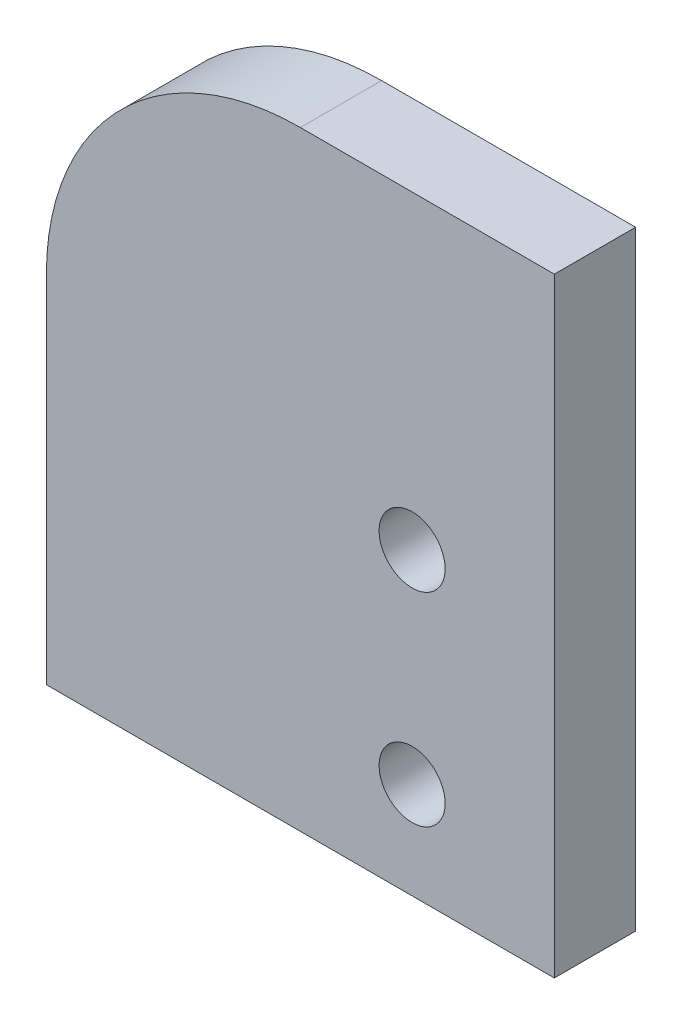
ISO-10303-21;
HEADER;
FILE_DESCRIPTION(('STEP AP214'),'2;1');
FILE_NAME('part.step','',(''),(''),'','','');
FILE_SCHEMA(('AUTOMOTIVE_DESIGN { 1 0 10303 214 1 1 1 1 }'));
ENDSEC;
DATA;
#1=APPLICATION_CONTEXT('core data for automotive mechanical design processes');
#2=APPLICATION_PROTOCOL_DEFINITION('international standard','automotive_design',2000,#1);
#3=PRODUCT_CONTEXT('',#1,'mechanical');
#4=PRODUCT('Part','Part','',(#3));
#5=PRODUCT_RELATED_PRODUCT_CATEGORY('part','',(#4));
#6=PRODUCT_DEFINITION_FORMATION('','',#4);
#7=PRODUCT_DEFINITION_CONTEXT('part definition',#1,'design');
#8=PRODUCT_DEFINITION('design','',#6,#7);
#9=PRODUCT_DEFINITION_SHAPE('','',#8);
#10=(LENGTH_UNIT() NAMED_UNIT(*) SI_UNIT(.MILLI.,.METRE.));
#11=(NAMED_UNIT(*) PLANE_ANGLE_UNIT() SI_UNIT($,.RADIAN.));
#12=(NAMED_UNIT(*) SI_UNIT($,.STERADIAN.) SOLID_ANGLE_UNIT());
#13=UNCERTAINTY_MEASURE_WITH_UNIT(LENGTH_MEASURE(1.E-05),#10,'distance_accuracy_value','');
#14=(GEOMETRIC_REPRESENTATION_CONTEXT(3) GLOBAL_UNCERTAINTY_ASSIGNED_CONTEXT((#13)) GLOBAL_UNIT_ASSIGNED_CONTEXT((#10,
#11,#12)) REPRESENTATION_CONTEXT('',''));
#15=CARTESIAN_POINT('',(0.,0.,0.));
#16=DIRECTION('',(0.,0.,1.));
#17=DIRECTION('',(1.,0.,0.));
#18=AXIS2_PLACEMENT_3D('',#15,#16,#17);
#19=CARTESIAN_POINT('',(0.,20.,4.));
#20=DIRECTION('',(-1.,0.,0.));
#21=DIRECTION('',(0.,0.,1.));
#22=AXIS2_PLACEMENT_3D('',#19,#20,#21);
#23=PLANE('',#22);
#24=DIRECTION('',(0.,1.,0.));
#25=VECTOR('',#24,1.);
#26=CARTESIAN_POINT('',(0.,20.,0.));
#27=LINE('',#26,#25);
#28=CARTESIAN_POINT('',(0.,0.,0.));
#29=VERTEX_POINT('',#28);
#30=CARTESIAN_POINT('',(0.,30.,0.));
#31=VERTEX_POINT('',#30);
#32=EDGE_CURVE('E76',#29,#31,#27,.T.);
#33=ORIENTED_EDGE('',*,*,#32,.T.);
#34=DIRECTION('',(0.,0.,-1.));
#35=VECTOR('',#34,1.);
#36=CARTESIAN_POINT('',(0.,30.,4.));
#37=LINE('',#36,#35);
#38=CARTESIAN_POINT('',(0.,30.,4.));
#39=VERTEX_POINT('',#38);
#40=EDGE_CURVE('E11',#39,#31,#37,.T.);
#41=ORIENTED_EDGE('',*,*,#40,.F.);
#42=DIRECTION('',(0.,1.,0.));
#43=VECTOR('',#42,1.);
#44=CARTESIAN_POINT('',(0.,0.,4.));
#45=LINE('',#44,#43);
#46=CARTESIAN_POINT('',(0.,0.,4.));
#47=VERTEX_POINT('',#46);
#48=EDGE_CURVE('E82',#47,#39,#45,.T.);
#49=ORIENTED_EDGE('',*,*,#48,.F.);
#50=DIRECTION('',(0.,0.,-1.));
#51=VECTOR('',#50,1.);
#52=CARTESIAN_POINT('',(0.,0.,4.));
#53=LINE('',#52,#51);
#54=EDGE_CURVE('E106',#47,#29,#53,.T.);
#55=ORIENTED_EDGE('',*,*,#54,.T.);
#56=EDGE_LOOP('',(#33,#41,#49,#55));
#57=FACE_BOUND('',#56,.T.);
#58=ADVANCED_FACE('F33',(#57),#23,.F.);
#59=CARTESIAN_POINT('',(-12.5,30.,4.));
#60=DIRECTION('',(0.,-1.,0.));
#61=DIRECTION('',(0.,0.,-1.));
#62=AXIS2_PLACEMENT_3D('',#59,#60,#61);
#63=PLANE('',#62);
#64=DIRECTION('',(-1.,0.,0.));
#65=VECTOR('',#64,1.);
#66=CARTESIAN_POINT('',(-12.5,30.,0.));
#67=LINE('',#66,#65);
#68=CARTESIAN_POINT('',(-12.5,30.,0.));
#69=VERTEX_POINT('',#68);
#70=EDGE_CURVE('E111',#31,#69,#67,.T.);
#71=ORIENTED_EDGE('',*,*,#70,.T.);
#72=DIRECTION('',(0.,0.,-1.));
#73=VECTOR('',#72,1.);
#74=CARTESIAN_POINT('',(-12.5,30.,4.));
#75=LINE('',#74,#73);
#76=CARTESIAN_POINT('',(-12.5,30.,4.));
#77=VERTEX_POINT('',#76);
#78=EDGE_CURVE('E41',#77,#69,#75,.T.);
#79=ORIENTED_EDGE('',*,*,#78,.F.);
#80=DIRECTION('',(-1.,0.,0.));
#81=VECTOR('',#80,1.);
#82=CARTESIAN_POINT('',(-12.5,30.,4.));
#83=LINE('',#82,#81);
#84=EDGE_CURVE('E93',#39,#77,#83,.T.);
#85=ORIENTED_EDGE('',*,*,#84,.F.);
#86=ORIENTED_EDGE('',*,*,#40,.T.);
#87=EDGE_LOOP('',(#71,#79,#85,#86));
#88=FACE_BOUND('',#87,.T.);
#89=ADVANCED_FACE('F162',(#88),#63,.F.);
#90=CARTESIAN_POINT('',(-12.5,17.5,4.));
#91=DIRECTION('',(0.,0.,-1.));
#92=DIRECTION('',(-1.,0.,0.));
#93=AXIS2_PLACEMENT_3D('',#90,#91,#92);
#94=CYLINDRICAL_SURFACE('',#93,12.5);
#95=CARTESIAN_POINT('',(-12.5,17.5,0.));
#96=DIRECTION('',(0.,0.,1.));
#97=DIRECTION('',(1.,0.,0.));
#98=AXIS2_PLACEMENT_3D('',#95,#96,#97);
#99=CIRCLE('',#98,12.5);
#100=CARTESIAN_POINT('',(-25.,17.5,0.));
#101=VERTEX_POINT('',#100);
#102=EDGE_CURVE('E101',#69,#101,#99,.T.);
#103=ORIENTED_EDGE('',*,*,#102,.T.);
#104=DIRECTION('',(0.,0.,-1.));
#105=VECTOR('',#104,1.);
#106=CARTESIAN_POINT('',(-25.,17.5,4.));
#107=LINE('',#106,#105);
#108=CARTESIAN_POINT('',(-25.,17.5,4.));
#109=VERTEX_POINT('',#108);
#110=EDGE_CURVE('E98',#109,#101,#107,.T.);
#111=ORIENTED_EDGE('',*,*,#110,.F.);
#112=CARTESIAN_POINT('',(-12.5,17.5,4.));
#113=DIRECTION('',(0.,0.,1.));
#114=DIRECTION('',(1.,0.,0.));
#115=AXIS2_PLACEMENT_3D('',#112,#113,#114);
#116=CIRCLE('',#115,12.5);
#117=EDGE_CURVE('E87',#77,#109,#116,.T.);
#118=ORIENTED_EDGE('',*,*,#117,.F.);
#119=ORIENTED_EDGE('',*,*,#78,.T.);
#120=EDGE_LOOP('',(#103,#111,#118,#119));
#121=FACE_BOUND('',#120,.T.);
#122=ADVANCED_FACE('F99',(#121),#94,.T.);
#123=CARTESIAN_POINT('',(-25.,0.,4.));
#124=DIRECTION('',(1.,0.,0.));
#125=DIRECTION('',(0.,0.,-1.));
#126=AXIS2_PLACEMENT_3D('',#123,#124,#125);
#127=PLANE('',#126);
#128=DIRECTION('',(0.,-1.,0.));
#129=VECTOR('',#128,1.);
#130=CARTESIAN_POINT('',(-25.,0.,0.));
#131=LINE('',#130,#129);
#132=CARTESIAN_POINT('',(-25.,0.,0.));
#133=VERTEX_POINT('',#132);
#134=EDGE_CURVE('E69',#101,#133,#131,.T.);
#135=ORIENTED_EDGE('',*,*,#134,.T.);
#136=DIRECTION('',(0.,0.,-1.));
#137=VECTOR('',#136,1.);
#138=CARTESIAN_POINT('',(-25.,0.,4.));
#139=LINE('',#138,#137);
#140=CARTESIAN_POINT('',(-25.,0.,4.));
#141=VERTEX_POINT('',#140);
#142=EDGE_CURVE('E102',#141,#133,#139,.T.);
#143=ORIENTED_EDGE('',*,*,#142,.F.);
#144=DIRECTION('',(0.,-1.,0.));
#145=VECTOR('',#144,1.);
#146=CARTESIAN_POINT('',(-25.,0.,4.));
#147=LINE('',#146,#145);
#148=EDGE_CURVE('E91',#109,#141,#147,.T.);
#149=ORIENTED_EDGE('',*,*,#148,.F.);
#150=ORIENTED_EDGE('',*,*,#110,.T.);
#151=EDGE_LOOP('',(#135,#143,#149,#150));
#152=FACE_BOUND('',#151,.T.);
#153=ADVANCED_FACE('F104',(#152),#127,.F.);
#154=CARTESIAN_POINT('',(0.,0.,4.));
#155=DIRECTION('',(0.,1.,0.));
#156=DIRECTION('',(-1.,0.,0.));
#157=AXIS2_PLACEMENT_3D('',#154,#155,#156);
#158=PLANE('',#157);
#159=DIRECTION('',(1.,0.,0.));
#160=VECTOR('',#159,1.);
#161=CARTESIAN_POINT('',(0.,0.,0.));
#162=LINE('',#161,#160);
#163=EDGE_CURVE('E116',#133,#29,#162,.T.);
#164=ORIENTED_EDGE('',*,*,#163,.T.);
#165=ORIENTED_EDGE('',*,*,#54,.F.);
#166=DIRECTION('',(1.,0.,0.));
#167=VECTOR('',#166,1.);
#168=CARTESIAN_POINT('',(0.,0.,4.));
#169=LINE('',#168,#167);
#170=EDGE_CURVE('E49',#141,#47,#169,.T.);
#171=ORIENTED_EDGE('',*,*,#170,.F.);
#172=ORIENTED_EDGE('',*,*,#142,.T.);
#173=EDGE_LOOP('',(#164,#165,#171,#172));
#174=FACE_BOUND('',#173,.T.);
#175=ADVANCED_FACE('F123',(#174),#158,.F.);
#176=CARTESIAN_POINT('',(-12.5,17.5,4.));
#177=DIRECTION('',(0.,0.,1.));
#178=DIRECTION('',(1.,0.,0.));
#179=AXIS2_PLACEMENT_3D('',#176,#177,#178);
#180=PLANE('',#179);
#181=CARTESIAN_POINT('',(-7.,4.75,4.));
#182=DIRECTION('',(0.,0.,1.));
#183=DIRECTION('',(1.,0.,0.));
#184=AXIS2_PLACEMENT_3D('',#181,#182,#183);
#185=CIRCLE('',#184,1.625);
#186=CARTESIAN_POINT('',(-5.375,4.75,4.));
#187=VERTEX_POINT('',#186);
#188=EDGE_CURVE('E133',#187,#187,#185,.T.);
#189=ORIENTED_EDGE('',*,*,#188,.F.);
#190=EDGE_LOOP('',(#189));
#191=FACE_BOUND('',#190,.T.);
#192=CARTESIAN_POINT('',(-7.,14.75,4.));
#193=DIRECTION('',(0.,0.,1.));
#194=DIRECTION('',(1.,0.,0.));
#195=AXIS2_PLACEMENT_3D('',#192,#193,#194);
#196=CIRCLE('',#195,1.625);
#197=CARTESIAN_POINT('',(-5.375,14.75,4.));
#198=VERTEX_POINT('',#197);
#199=EDGE_CURVE('E127',#198,#198,#196,.T.);
#200=ORIENTED_EDGE('',*,*,#199,.F.);
#201=EDGE_LOOP('',(#200));
#202=FACE_BOUND('',#201,.T.);
#203=ORIENTED_EDGE('',*,*,#48,.T.);
#204=ORIENTED_EDGE('',*,*,#84,.T.);
#205=ORIENTED_EDGE('',*,*,#117,.T.);
#206=ORIENTED_EDGE('',*,*,#148,.T.);
#207=ORIENTED_EDGE('',*,*,#170,.T.);
#208=EDGE_LOOP('',(#203,#204,#205,#206,#207));
#209=FACE_BOUND('',#208,.T.);
#210=ADVANCED_FACE('F89',(#191,#202,#209),#180,.T.);
#211=CARTESIAN_POINT('',(-12.5,17.5,0.));
#212=DIRECTION('',(0.,0.,1.));
#213=DIRECTION('',(1.,0.,0.));
#214=AXIS2_PLACEMENT_3D('',#211,#212,#213);
#215=PLANE('',#214);
#216=CARTESIAN_POINT('',(-7.,4.75,0.));
#217=DIRECTION('',(0.,0.,1.));
#218=DIRECTION('',(1.,0.,0.));
#219=AXIS2_PLACEMENT_3D('',#216,#217,#218);
#220=CIRCLE('',#219,1.625);
#221=CARTESIAN_POINT('',(-5.375,4.75,0.));
#222=VERTEX_POINT('',#221);
#223=EDGE_CURVE('E130',#222,#222,#220,.T.);
#224=ORIENTED_EDGE('',*,*,#223,.T.);
#225=EDGE_LOOP('',(#224));
#226=FACE_BOUND('',#225,.T.);
#227=CARTESIAN_POINT('',(-7.,14.75,0.));
#228=DIRECTION('',(0.,0.,1.));
#229=DIRECTION('',(1.,0.,0.));
#230=AXIS2_PLACEMENT_3D('',#227,#228,#229);
#231=CIRCLE('',#230,1.625);
#232=CARTESIAN_POINT('',(-5.375,14.75,0.));
#233=VERTEX_POINT('',#232);
#234=EDGE_CURVE('E112',#233,#233,#231,.T.);
#235=ORIENTED_EDGE('',*,*,#234,.T.);
#236=EDGE_LOOP('',(#235));
#237=FACE_BOUND('',#236,.T.);
#238=ORIENTED_EDGE('',*,*,#32,.F.);
#239=ORIENTED_EDGE('',*,*,#163,.F.);
#240=ORIENTED_EDGE('',*,*,#134,.F.);
#241=ORIENTED_EDGE('',*,*,#102,.F.);
#242=ORIENTED_EDGE('',*,*,#70,.F.);
#243=EDGE_LOOP('',(#238,#239,#240,#241,#242));
#244=FACE_BOUND('',#243,.T.);
#245=ADVANCED_FACE('F121',(#226,#237,#244),#215,.F.);
#246=CARTESIAN_POINT('',(-7.,14.75,0.));
#247=DIRECTION('',(0.,0.,1.));
#248=DIRECTION('',(1.,0.,0.));
#249=AXIS2_PLACEMENT_3D('',#246,#247,#248);
#250=CYLINDRICAL_SURFACE('',#249,1.625);
#251=ORIENTED_EDGE('',*,*,#234,.F.);
#252=EDGE_LOOP('',(#251));
#253=FACE_BOUND('',#252,.T.);
#254=ORIENTED_EDGE('',*,*,#199,.T.);
#255=EDGE_LOOP('',(#254));
#256=FACE_BOUND('',#255,.T.);
#257=ADVANCED_FACE('F144',(#253,#256),#250,.F.);
#258=CARTESIAN_POINT('',(-7.,4.75,0.));
#259=DIRECTION('',(0.,0.,1.));
#260=DIRECTION('',(1.,0.,0.));
#261=AXIS2_PLACEMENT_3D('',#258,#259,#260);
#262=CYLINDRICAL_SURFACE('',#261,1.625);
#263=ORIENTED_EDGE('',*,*,#223,.F.);
#264=EDGE_LOOP('',(#263));
#265=FACE_BOUND('',#264,.T.);
#266=ORIENTED_EDGE('',*,*,#188,.T.);
#267=EDGE_LOOP('',(#266));
#268=FACE_BOUND('',#267,.T.);
#269=ADVANCED_FACE('F141',(#265,#268),#262,.F.);
#270=CLOSED_SHELL('',(#58,#89,#122,#153,#175,#210,#245,#257,#269));
#271=MANIFOLD_SOLID_BREP('B2',#270);
#272=ADVANCED_BREP_SHAPE_REPRESENTATION('',(#18,#271),#14);
#273=SHAPE_DEFINITION_REPRESENTATION(#9,#272);
ENDSEC;
END-ISO-10303-21;
